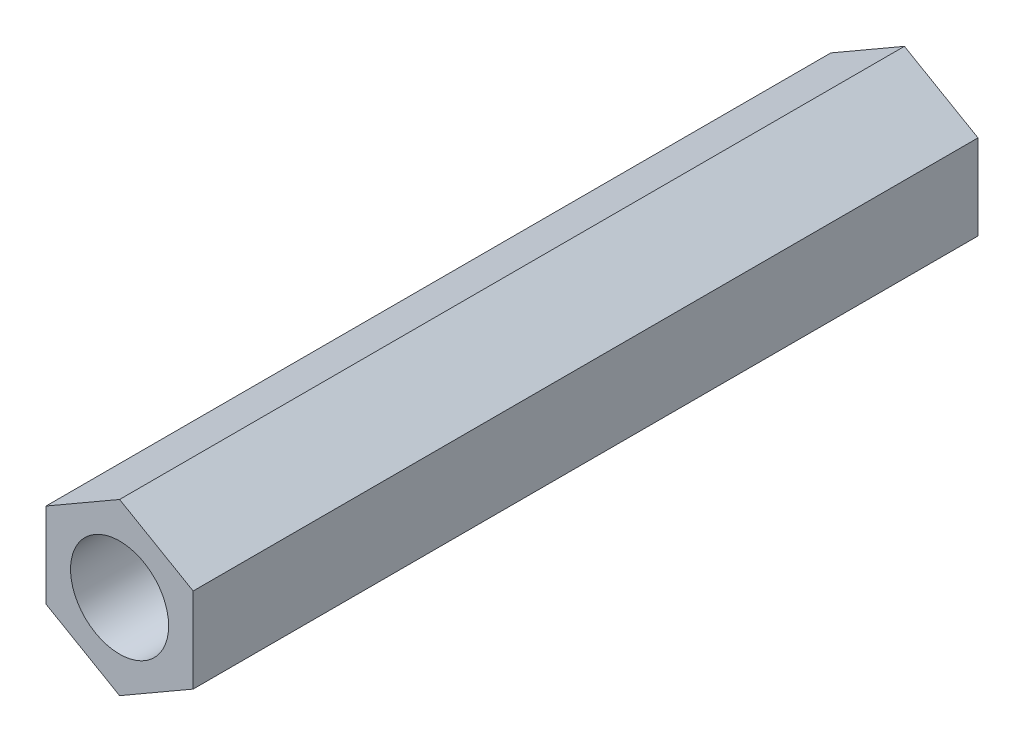
ISO-10303-21;
HEADER;
FILE_DESCRIPTION(('STEP AP214'),'2;1');
FILE_NAME('part.step','',(''),(''),'','','');
FILE_SCHEMA(('AUTOMOTIVE_DESIGN { 1 0 10303 214 1 1 1 1 }'));
ENDSEC;
DATA;
#1=APPLICATION_CONTEXT('core data for automotive mechanical design processes');
#2=APPLICATION_PROTOCOL_DEFINITION('international standard','automotive_design',2000,#1);
#3=PRODUCT_CONTEXT('',#1,'mechanical');
#4=PRODUCT('Part','Part','',(#3));
#5=PRODUCT_RELATED_PRODUCT_CATEGORY('part','',(#4));
#6=PRODUCT_DEFINITION_FORMATION('','',#4);
#7=PRODUCT_DEFINITION_CONTEXT('part definition',#1,'design');
#8=PRODUCT_DEFINITION('design','',#6,#7);
#9=PRODUCT_DEFINITION_SHAPE('','',#8);
#10=(LENGTH_UNIT() NAMED_UNIT(*) SI_UNIT(.MILLI.,.METRE.));
#11=(NAMED_UNIT(*) PLANE_ANGLE_UNIT() SI_UNIT($,.RADIAN.));
#12=(NAMED_UNIT(*) SI_UNIT($,.STERADIAN.) SOLID_ANGLE_UNIT());
#13=UNCERTAINTY_MEASURE_WITH_UNIT(LENGTH_MEASURE(1.E-05),#10,'distance_accuracy_value','');
#14=(GEOMETRIC_REPRESENTATION_CONTEXT(3) GLOBAL_UNCERTAINTY_ASSIGNED_CONTEXT((#13)) GLOBAL_UNIT_ASSIGNED_CONTEXT((#10,
#11,#12)) REPRESENTATION_CONTEXT('',''));
#15=CARTESIAN_POINT('',(0.,0.,0.));
#16=DIRECTION('',(0.,0.,1.));
#17=DIRECTION('',(1.,0.,0.));
#18=AXIS2_PLACEMENT_3D('',#15,#16,#17);
#19=CARTESIAN_POINT('',(0.,0.,16.));
#20=DIRECTION('',(0.,0.,1.));
#21=DIRECTION('',(1.,0.,0.));
#22=AXIS2_PLACEMENT_3D('',#19,#20,#21);
#23=PLANE('',#22);
#24=DIRECTION('',(0.,1.,0.));
#25=VECTOR('',#24,1.);
#26=CARTESIAN_POINT('',(1.5,-0.86602540378444,16.));
#27=LINE('',#26,#25);
#28=CARTESIAN_POINT('',(1.5,-0.86602540378444,16.));
#29=VERTEX_POINT('',#28);
#30=CARTESIAN_POINT('',(1.5,0.866025403784439,16.));
#31=VERTEX_POINT('',#30);
#32=EDGE_CURVE('E133',#29,#31,#27,.T.);
#33=ORIENTED_EDGE('',*,*,#32,.T.);
#34=DIRECTION('',(-0.866025403784439,0.5,0.));
#35=VECTOR('',#34,1.);
#36=CARTESIAN_POINT('',(1.5,0.866025403784439,16.));
#37=LINE('',#36,#35);
#38=CARTESIAN_POINT('',(0.,1.73205080756888,16.));
#39=VERTEX_POINT('',#38);
#40=EDGE_CURVE('E91',#31,#39,#37,.T.);
#41=ORIENTED_EDGE('',*,*,#40,.T.);
#42=DIRECTION('',(-0.866025403784439,-0.5,0.));
#43=VECTOR('',#42,1.);
#44=CARTESIAN_POINT('',(0.,1.73205080756888,16.));
#45=LINE('',#44,#43);
#46=CARTESIAN_POINT('',(-1.5,0.866025403784439,16.));
#47=VERTEX_POINT('',#46);
#48=EDGE_CURVE('E104',#39,#47,#45,.T.);
#49=ORIENTED_EDGE('',*,*,#48,.T.);
#50=DIRECTION('',(0.,-1.,0.));
#51=VECTOR('',#50,1.);
#52=CARTESIAN_POINT('',(-1.5,0.866025403784439,16.));
#53=LINE('',#52,#51);
#54=CARTESIAN_POINT('',(-1.5,-0.866025403784438,16.));
#55=VERTEX_POINT('',#54);
#56=EDGE_CURVE('E98',#47,#55,#53,.T.);
#57=ORIENTED_EDGE('',*,*,#56,.T.);
#58=DIRECTION('',(0.866025403784439,-0.5,0.));
#59=VECTOR('',#58,1.);
#60=CARTESIAN_POINT('',(-1.5,-0.866025403784438,16.));
#61=LINE('',#60,#59);
#62=CARTESIAN_POINT('',(0.,-1.73205080756888,16.));
#63=VERTEX_POINT('',#62);
#64=EDGE_CURVE('E102',#55,#63,#61,.T.);
#65=ORIENTED_EDGE('',*,*,#64,.T.);
#66=DIRECTION('',(0.866025403784439,0.5,0.));
#67=VECTOR('',#66,1.);
#68=CARTESIAN_POINT('',(0.,-1.73205080756888,16.));
#69=LINE('',#68,#67);
#70=EDGE_CURVE('E54',#63,#29,#69,.T.);
#71=ORIENTED_EDGE('',*,*,#70,.T.);
#72=EDGE_LOOP('',(#33,#41,#49,#57,#65,#71));
#73=FACE_BOUND('',#72,.T.);
#74=CARTESIAN_POINT('',(0.,0.,16.));
#75=DIRECTION('',(0.,0.,1.));
#76=DIRECTION('',(1.,0.,0.));
#77=AXIS2_PLACEMENT_3D('',#74,#75,#76);
#78=CIRCLE('',#77,1.);
#79=CARTESIAN_POINT('',(1.,0.,16.));
#80=VERTEX_POINT('',#79);
#81=EDGE_CURVE('E126',#80,#80,#78,.T.);
#82=ORIENTED_EDGE('',*,*,#81,.F.);
#83=EDGE_LOOP('',(#82));
#84=FACE_BOUND('',#83,.T.);
#85=ADVANCED_FACE('F37',(#73,#84),#23,.T.);
#86=CARTESIAN_POINT('',(0.,0.,0.));
#87=DIRECTION('',(0.,0.,1.));
#88=DIRECTION('',(1.,0.,0.));
#89=AXIS2_PLACEMENT_3D('',#86,#87,#88);
#90=PLANE('',#89);
#91=DIRECTION('',(0.,1.,0.));
#92=VECTOR('',#91,1.);
#93=CARTESIAN_POINT('',(1.5,-0.86602540378444,0.));
#94=LINE('',#93,#92);
#95=CARTESIAN_POINT('',(1.5,-0.86602540378444,0.));
#96=VERTEX_POINT('',#95);
#97=CARTESIAN_POINT('',(1.5,0.866025403784439,0.));
#98=VERTEX_POINT('',#97);
#99=EDGE_CURVE('E122',#96,#98,#94,.T.);
#100=ORIENTED_EDGE('',*,*,#99,.F.);
#101=DIRECTION('',(0.866025403784439,0.5,0.));
#102=VECTOR('',#101,1.);
#103=CARTESIAN_POINT('',(0.,-1.73205080756888,0.));
#104=LINE('',#103,#102);
#105=CARTESIAN_POINT('',(0.,-1.73205080756888,0.));
#106=VERTEX_POINT('',#105);
#107=EDGE_CURVE('E83',#106,#96,#104,.T.);
#108=ORIENTED_EDGE('',*,*,#107,.F.);
#109=DIRECTION('',(0.866025403784439,-0.5,0.));
#110=VECTOR('',#109,1.);
#111=CARTESIAN_POINT('',(-1.5,-0.866025403784438,0.));
#112=LINE('',#111,#110);
#113=CARTESIAN_POINT('',(-1.5,-0.866025403784438,0.));
#114=VERTEX_POINT('',#113);
#115=EDGE_CURVE('E77',#114,#106,#112,.T.);
#116=ORIENTED_EDGE('',*,*,#115,.F.);
#117=DIRECTION('',(0.,-1.,0.));
#118=VECTOR('',#117,1.);
#119=CARTESIAN_POINT('',(-1.5,0.866025403784439,0.));
#120=LINE('',#119,#118);
#121=CARTESIAN_POINT('',(-1.5,0.866025403784439,0.));
#122=VERTEX_POINT('',#121);
#123=EDGE_CURVE('E112',#122,#114,#120,.T.);
#124=ORIENTED_EDGE('',*,*,#123,.F.);
#125=DIRECTION('',(-0.866025403784439,-0.5,0.));
#126=VECTOR('',#125,1.);
#127=CARTESIAN_POINT('',(0.,1.73205080756888,0.));
#128=LINE('',#127,#126);
#129=CARTESIAN_POINT('',(0.,1.73205080756888,0.));
#130=VERTEX_POINT('',#129);
#131=EDGE_CURVE('E128',#130,#122,#128,.T.);
#132=ORIENTED_EDGE('',*,*,#131,.F.);
#133=DIRECTION('',(-0.866025403784439,0.5,0.));
#134=VECTOR('',#133,1.);
#135=CARTESIAN_POINT('',(1.5,0.866025403784439,0.));
#136=LINE('',#135,#134);
#137=EDGE_CURVE('E125',#98,#130,#136,.T.);
#138=ORIENTED_EDGE('',*,*,#137,.F.);
#139=EDGE_LOOP('',(#100,#108,#116,#124,#132,#138));
#140=FACE_BOUND('',#139,.T.);
#141=CARTESIAN_POINT('',(0.,0.,0.));
#142=DIRECTION('',(0.,0.,1.));
#143=DIRECTION('',(1.,0.,0.));
#144=AXIS2_PLACEMENT_3D('',#141,#142,#143);
#145=CIRCLE('',#144,1.);
#146=CARTESIAN_POINT('',(1.,0.,0.));
#147=VERTEX_POINT('',#146);
#148=EDGE_CURVE('E244',#147,#147,#145,.T.);
#149=ORIENTED_EDGE('',*,*,#148,.T.);
#150=EDGE_LOOP('',(#149));
#151=FACE_BOUND('',#150,.T.);
#152=ADVANCED_FACE('F142',(#140,#151),#90,.F.);
#153=CARTESIAN_POINT('',(1.5,-0.86602540378444,16.));
#154=DIRECTION('',(-1.,0.,0.));
#155=DIRECTION('',(0.,0.,1.));
#156=AXIS2_PLACEMENT_3D('',#153,#154,#155);
#157=PLANE('',#156);
#158=ORIENTED_EDGE('',*,*,#99,.T.);
#159=DIRECTION('',(0.,0.,-1.));
#160=VECTOR('',#159,1.);
#161=CARTESIAN_POINT('',(1.5,0.866025403784439,16.));
#162=LINE('',#161,#160);
#163=EDGE_CURVE('E11',#31,#98,#162,.T.);
#164=ORIENTED_EDGE('',*,*,#163,.F.);
#165=ORIENTED_EDGE('',*,*,#32,.F.);
#166=DIRECTION('',(0.,0.,-1.));
#167=VECTOR('',#166,1.);
#168=CARTESIAN_POINT('',(1.5,-0.86602540378444,16.));
#169=LINE('',#168,#167);
#170=EDGE_CURVE('E118',#29,#96,#169,.T.);
#171=ORIENTED_EDGE('',*,*,#170,.T.);
#172=EDGE_LOOP('',(#158,#164,#165,#171));
#173=FACE_BOUND('',#172,.T.);
#174=ADVANCED_FACE('F39',(#173),#157,.F.);
#175=CARTESIAN_POINT('',(1.5,0.866025403784439,16.));
#176=DIRECTION('',(-0.5,-0.866025403784439,0.));
#177=DIRECTION('',(0.866025403784439,-0.5,0.));
#178=AXIS2_PLACEMENT_3D('',#175,#176,#177);
#179=PLANE('',#178);
#180=ORIENTED_EDGE('',*,*,#137,.T.);
#181=DIRECTION('',(0.,0.,-1.));
#182=VECTOR('',#181,1.);
#183=CARTESIAN_POINT('',(0.,1.73205080756888,16.));
#184=LINE('',#183,#182);
#185=EDGE_CURVE('E46',#39,#130,#184,.T.);
#186=ORIENTED_EDGE('',*,*,#185,.F.);
#187=ORIENTED_EDGE('',*,*,#40,.F.);
#188=ORIENTED_EDGE('',*,*,#163,.T.);
#189=EDGE_LOOP('',(#180,#186,#187,#188));
#190=FACE_BOUND('',#189,.T.);
#191=ADVANCED_FACE('F167',(#190),#179,.F.);
#192=CARTESIAN_POINT('',(0.,1.73205080756888,16.));
#193=DIRECTION('',(0.5,-0.866025403784439,0.));
#194=DIRECTION('',(0.866025403784439,0.5,0.));
#195=AXIS2_PLACEMENT_3D('',#192,#193,#194);
#196=PLANE('',#195);
#197=ORIENTED_EDGE('',*,*,#131,.T.);
#198=DIRECTION('',(0.,0.,-1.));
#199=VECTOR('',#198,1.);
#200=CARTESIAN_POINT('',(-1.5,0.866025403784439,16.));
#201=LINE('',#200,#199);
#202=EDGE_CURVE('E113',#47,#122,#201,.T.);
#203=ORIENTED_EDGE('',*,*,#202,.F.);
#204=ORIENTED_EDGE('',*,*,#48,.F.);
#205=ORIENTED_EDGE('',*,*,#185,.T.);
#206=EDGE_LOOP('',(#197,#203,#204,#205));
#207=FACE_BOUND('',#206,.T.);
#208=ADVANCED_FACE('F139',(#207),#196,.F.);
#209=CARTESIAN_POINT('',(-1.5,0.866025403784439,16.));
#210=DIRECTION('',(1.,0.,0.));
#211=DIRECTION('',(0.,0.,-1.));
#212=AXIS2_PLACEMENT_3D('',#209,#210,#211);
#213=PLANE('',#212);
#214=ORIENTED_EDGE('',*,*,#123,.T.);
#215=DIRECTION('',(0.,0.,-1.));
#216=VECTOR('',#215,1.);
#217=CARTESIAN_POINT('',(-1.5,-0.866025403784438,16.));
#218=LINE('',#217,#216);
#219=EDGE_CURVE('E109',#55,#114,#218,.T.);
#220=ORIENTED_EDGE('',*,*,#219,.F.);
#221=ORIENTED_EDGE('',*,*,#56,.F.);
#222=ORIENTED_EDGE('',*,*,#202,.T.);
#223=EDGE_LOOP('',(#214,#220,#221,#222));
#224=FACE_BOUND('',#223,.T.);
#225=ADVANCED_FACE('F110',(#224),#213,.F.);
#226=CARTESIAN_POINT('',(-1.5,-0.866025403784438,16.));
#227=DIRECTION('',(0.5,0.866025403784439,0.));
#228=DIRECTION('',(-0.866025403784439,0.5,0.));
#229=AXIS2_PLACEMENT_3D('',#226,#227,#228);
#230=PLANE('',#229);
#231=ORIENTED_EDGE('',*,*,#115,.T.);
#232=DIRECTION('',(0.,0.,-1.));
#233=VECTOR('',#232,1.);
#234=CARTESIAN_POINT('',(0.,-1.73205080756888,16.));
#235=LINE('',#234,#233);
#236=EDGE_CURVE('E114',#63,#106,#235,.T.);
#237=ORIENTED_EDGE('',*,*,#236,.F.);
#238=ORIENTED_EDGE('',*,*,#64,.F.);
#239=ORIENTED_EDGE('',*,*,#219,.T.);
#240=EDGE_LOOP('',(#231,#237,#238,#239));
#241=FACE_BOUND('',#240,.T.);
#242=ADVANCED_FACE('F116',(#241),#230,.F.);
#243=CARTESIAN_POINT('',(0.,-1.73205080756888,16.));
#244=DIRECTION('',(-0.5,0.866025403784439,0.));
#245=DIRECTION('',(-0.866025403784439,-0.5,0.));
#246=AXIS2_PLACEMENT_3D('',#243,#244,#245);
#247=PLANE('',#246);
#248=ORIENTED_EDGE('',*,*,#107,.T.);
#249=ORIENTED_EDGE('',*,*,#170,.F.);
#250=ORIENTED_EDGE('',*,*,#70,.F.);
#251=ORIENTED_EDGE('',*,*,#236,.T.);
#252=EDGE_LOOP('',(#248,#249,#250,#251));
#253=FACE_BOUND('',#252,.T.);
#254=ADVANCED_FACE('F147',(#253),#247,.F.);
#255=CARTESIAN_POINT('',(0.,0.,16.));
#256=DIRECTION('',(0.,0.,-1.));
#257=DIRECTION('',(-1.,0.,0.));
#258=AXIS2_PLACEMENT_3D('',#255,#256,#257);
#259=CYLINDRICAL_SURFACE('',#258,1.);
#260=ORIENTED_EDGE('',*,*,#81,.T.);
#261=EDGE_LOOP('',(#260));
#262=FACE_BOUND('',#261,.T.);
#263=ORIENTED_EDGE('',*,*,#148,.F.);
#264=EDGE_LOOP('',(#263));
#265=FACE_BOUND('',#264,.T.);
#266=ADVANCED_FACE('F149',(#262,#265),#259,.F.);
#267=CLOSED_SHELL('',(#85,#152,#174,#191,#208,#225,#242,#254,#266));
#268=MANIFOLD_SOLID_BREP('B2',#267);
#269=ADVANCED_BREP_SHAPE_REPRESENTATION('',(#18,#268),#14);
#270=SHAPE_DEFINITION_REPRESENTATION(#9,#269);
ENDSEC;
END-ISO-10303-21;
